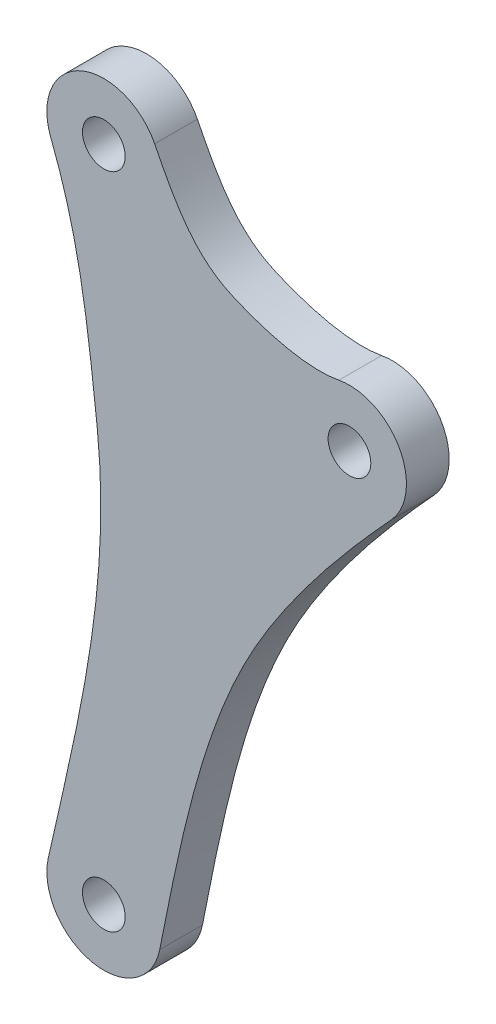
ISO-10303-21;
HEADER;
FILE_DESCRIPTION(('STEP AP214'),'2;1');
FILE_NAME('part.step','',(''),(''),'','','');
FILE_SCHEMA(('AUTOMOTIVE_DESIGN { 1 0 10303 214 1 1 1 1 }'));
ENDSEC;
DATA;
#1=APPLICATION_CONTEXT('core data for automotive mechanical design processes');
#2=APPLICATION_PROTOCOL_DEFINITION('international standard','automotive_design',2000,#1);
#3=PRODUCT_CONTEXT('',#1,'mechanical');
#4=PRODUCT('Part','Part','',(#3));
#5=PRODUCT_RELATED_PRODUCT_CATEGORY('part','',(#4));
#6=PRODUCT_DEFINITION_FORMATION('','',#4);
#7=PRODUCT_DEFINITION_CONTEXT('part definition',#1,'design');
#8=PRODUCT_DEFINITION('design','',#6,#7);
#9=PRODUCT_DEFINITION_SHAPE('','',#8);
#10=(LENGTH_UNIT() NAMED_UNIT(*) SI_UNIT(.MILLI.,.METRE.));
#11=(NAMED_UNIT(*) PLANE_ANGLE_UNIT() SI_UNIT($,.RADIAN.));
#12=(NAMED_UNIT(*) SI_UNIT($,.STERADIAN.) SOLID_ANGLE_UNIT());
#13=UNCERTAINTY_MEASURE_WITH_UNIT(LENGTH_MEASURE(1.E-05),#10,'distance_accuracy_value','');
#14=(GEOMETRIC_REPRESENTATION_CONTEXT(3) GLOBAL_UNCERTAINTY_ASSIGNED_CONTEXT((#13)) GLOBAL_UNIT_ASSIGNED_CONTEXT((#10,
#11,#12)) REPRESENTATION_CONTEXT('',''));
#15=CARTESIAN_POINT('',(0.,0.,0.));
#16=DIRECTION('',(0.,0.,1.));
#17=DIRECTION('',(1.,0.,0.));
#18=AXIS2_PLACEMENT_3D('',#15,#16,#17);
#19=CARTESIAN_POINT('',(90.075671226126,46.9690028449599,3.));
#20=DIRECTION('',(0.,0.,-1.));
#21=DIRECTION('',(-1.,0.,0.));
#22=AXIS2_PLACEMENT_3D('',#19,#20,#21);
#23=PLANE('',#22);
#24=CARTESIAN_POINT('',(98.2930047913281,65.3775283524419,3.));
#25=DIRECTION('',(0.,0.,1.));
#26=DIRECTION('',(1.,0.,0.));
#27=AXIS2_PLACEMENT_3D('',#24,#25,#26);
#28=CIRCLE('',#27,1.5);
#29=CARTESIAN_POINT('',(99.7930047913281,65.3775283524419,3.));
#30=VERTEX_POINT('',#29);
#31=EDGE_CURVE('E157',#30,#30,#28,.T.);
#32=ORIENTED_EDGE('',*,*,#31,.F.);
#33=EDGE_LOOP('',(#32));
#34=FACE_BOUND('',#33,.T.);
#35=CARTESIAN_POINT('',(84.9713185893899,28.397317520344,3.));
#36=CARTESIAN_POINT('',(86.5286245862136,36.2633686429194,3.));
#37=CARTESIAN_POINT('',(88.227335603752,44.7175231555254,3.));
#38=CARTESIAN_POINT('',(94.8996198148878,55.416000824392,3.));
#39=CARTESIAN_POINT('',(98.376312092243,59.555241306599,3.));
#40=CARTESIAN_POINT('',(101.238857322266,62.6716176248005,3.));
#41=B_SPLINE_CURVE_WITH_KNOTS('',3,(#35,#36,#37,#38,#39,#40),.UNSPECIFIED.,.F.,.F.,(4,1,1,4),
(0.,0.588358846523915,0.688358846523915,1.),.UNSPECIFIED.);
#42=CARTESIAN_POINT('',(84.9713185893899,28.397317520344,3.));
#43=VERTEX_POINT('',#42);
#44=CARTESIAN_POINT('',(101.238857322266,62.6716176248005,3.));
#45=VERTEX_POINT('',#44);
#46=EDGE_CURVE('E145',#43,#45,#41,.T.);
#47=ORIENTED_EDGE('',*,*,#46,.T.);
#48=CARTESIAN_POINT('',(98.2930047913281,65.3775283524419,3.));
#49=DIRECTION('',(0.,0.,1.));
#50=DIRECTION('',(1.,0.,0.));
#51=AXIS2_PLACEMENT_3D('',#48,#49,#50);
#52=CIRCLE('',#51,4.00000000000001);
#53=CARTESIAN_POINT('',(97.5465993612567,69.3072712109455,3.));
#54=VERTEX_POINT('',#53);
#55=EDGE_CURVE('E89',#45,#54,#52,.T.);
#56=ORIENTED_EDGE('',*,*,#55,.T.);
#57=CARTESIAN_POINT('',(97.5465993612567,69.3072712109455,3.));
#58=CARTESIAN_POINT('',(95.6927273527089,68.9551514454389,3.));
#59=CARTESIAN_POINT('',(92.7095800962212,69.5389356691718,3.));
#60=CARTESIAN_POINT('',(87.2845297615333,71.8966759610783,3.));
#61=CARTESIAN_POINT('',(85.7655546199661,74.9452628772232,3.));
#62=CARTESIAN_POINT('',(84.6155667565683,77.2148077148412,3.));
#63=B_SPLINE_CURVE_WITH_KNOTS('',3,(#57,#58,#59,#60,#61,#62),.UNSPECIFIED.,.F.,.F.,(4,1,1,4),
(0.,0.443899785183559,0.543899785183559,1.),.UNSPECIFIED.);
#64=CARTESIAN_POINT('',(84.6155667565683,77.2148077148412,3.));
#65=VERTEX_POINT('',#64);
#66=EDGE_CURVE('E102',#54,#65,#63,.T.);
#67=ORIENTED_EDGE('',*,*,#66,.T.);
#68=CARTESIAN_POINT('',(81.0474776232868,75.4068420246361,3.));
#69=DIRECTION('',(0.,0.,1.));
#70=DIRECTION('',(1.,0.,0.));
#71=AXIS2_PLACEMENT_3D('',#68,#69,#70);
#72=CIRCLE('',#71,4.00000000000001);
#73=CARTESIAN_POINT('',(77.3244716495254,73.9442325349442,3.));
#74=VERTEX_POINT('',#73);
#75=EDGE_CURVE('E96',#65,#74,#72,.T.);
#76=ORIENTED_EDGE('',*,*,#75,.T.);
#77=CARTESIAN_POINT('',(77.3244716495254,73.9442325349442,3.));
#78=CARTESIAN_POINT('',(79.1435622509706,69.3138200949018,3.));
#79=CARTESIAN_POINT('',(79.9310185017769,63.6887264714688,3.));
#80=CARTESIAN_POINT('',(81.6632709896459,48.786134392086,3.));
#81=CARTESIAN_POINT('',(79.0803085164264,38.6226873618722,3.));
#82=CARTESIAN_POINT('',(77.145713615016,30.0551956556259,3.));
#83=B_SPLINE_CURVE_WITH_KNOTS('',3,(#77,#78,#79,#80,#81,#82),.UNSPECIFIED.,.F.,.F.,(4,1,1,4),
(0.,0.323426504522803,0.423426504522803,1.),.UNSPECIFIED.);
#84=CARTESIAN_POINT('',(77.145713615016,30.0551956556259,3.));
#85=VERTEX_POINT('',#84);
#86=EDGE_CURVE('E100',#74,#85,#83,.T.);
#87=ORIENTED_EDGE('',*,*,#86,.T.);
#88=CARTESIAN_POINT('',(81.0474776232868,29.1741521698873,3.));
#89=DIRECTION('',(0.,0.,1.));
#90=DIRECTION('',(1.,0.,0.));
#91=AXIS2_PLACEMENT_3D('',#88,#89,#90);
#92=CIRCLE('',#91,4.00000000000001);
#93=EDGE_CURVE('E52',#85,#43,#92,.T.);
#94=ORIENTED_EDGE('',*,*,#93,.T.);
#95=EDGE_LOOP('',(#47,#56,#67,#76,#87,#94));
#96=FACE_BOUND('',#95,.T.);
#97=CARTESIAN_POINT('',(81.0474776232868,75.4068420246361,3.));
#98=DIRECTION('',(0.,0.,1.));
#99=DIRECTION('',(1.,0.,0.));
#100=AXIS2_PLACEMENT_3D('',#97,#98,#99);
#101=CIRCLE('',#100,1.5);
#102=CARTESIAN_POINT('',(82.5474776232868,75.4068420246361,3.));
#103=VERTEX_POINT('',#102);
#104=EDGE_CURVE('E156',#103,#103,#101,.T.);
#105=ORIENTED_EDGE('',*,*,#104,.F.);
#106=EDGE_LOOP('',(#105));
#107=FACE_BOUND('',#106,.T.);
#108=CARTESIAN_POINT('',(81.0474776232868,29.1741521698873,3.));
#109=DIRECTION('',(0.,0.,1.));
#110=DIRECTION('',(1.,0.,0.));
#111=AXIS2_PLACEMENT_3D('',#108,#109,#110);
#112=CIRCLE('',#111,1.5);
#113=CARTESIAN_POINT('',(82.5474776232868,29.1741521698873,3.));
#114=VERTEX_POINT('',#113);
#115=EDGE_CURVE('E164',#114,#114,#112,.T.);
#116=ORIENTED_EDGE('',*,*,#115,.F.);
#117=EDGE_LOOP('',(#116));
#118=FACE_BOUND('',#117,.T.);
#119=ADVANCED_FACE('F34',(#34,#96,#107,#118),#23,.F.);
#120=CARTESIAN_POINT('',(90.075671226126,46.9690028449599,0.));
#121=DIRECTION('',(0.,0.,-1.));
#122=DIRECTION('',(-1.,0.,0.));
#123=AXIS2_PLACEMENT_3D('',#120,#121,#122);
#124=PLANE('',#123);
#125=CARTESIAN_POINT('',(98.2930047913281,65.3775283524419,0.));
#126=DIRECTION('',(0.,0.,1.));
#127=DIRECTION('',(1.,0.,0.));
#128=AXIS2_PLACEMENT_3D('',#125,#126,#127);
#129=CIRCLE('',#128,1.5);
#130=CARTESIAN_POINT('',(99.7930047913281,65.3775283524419,0.));
#131=VERTEX_POINT('',#130);
#132=EDGE_CURVE('E161',#131,#131,#129,.T.);
#133=ORIENTED_EDGE('',*,*,#132,.T.);
#134=EDGE_LOOP('',(#133));
#135=FACE_BOUND('',#134,.T.);
#136=CARTESIAN_POINT('',(84.9713185893899,28.397317520344,0.));
#137=CARTESIAN_POINT('',(86.5286245862136,36.2633686429194,0.));
#138=CARTESIAN_POINT('',(88.227335603752,44.7175231555254,0.));
#139=CARTESIAN_POINT('',(94.8996198148878,55.416000824392,0.));
#140=CARTESIAN_POINT('',(98.376312092243,59.555241306599,0.));
#141=CARTESIAN_POINT('',(101.238857322266,62.6716176248005,0.));
#142=B_SPLINE_CURVE_WITH_KNOTS('',3,(#136,#137,#138,#139,#140,#141),.UNSPECIFIED.,.F.,.F.,(4,1,
1,4),(0.,0.588358846523915,0.688358846523915,1.),.UNSPECIFIED.);
#143=CARTESIAN_POINT('',(84.9713185893899,28.397317520344,0.));
#144=VERTEX_POINT('',#143);
#145=CARTESIAN_POINT('',(101.238857322266,62.6716176248005,0.));
#146=VERTEX_POINT('',#145);
#147=EDGE_CURVE('E160',#144,#146,#142,.T.);
#148=ORIENTED_EDGE('',*,*,#147,.F.);
#149=CARTESIAN_POINT('',(81.0474776232868,29.1741521698873,0.));
#150=DIRECTION('',(0.,0.,1.));
#151=DIRECTION('',(1.,0.,0.));
#152=AXIS2_PLACEMENT_3D('',#149,#150,#151);
#153=CIRCLE('',#152,4.00000000000001);
#154=CARTESIAN_POINT('',(77.145713615016,30.0551956556259,0.));
#155=VERTEX_POINT('',#154);
#156=EDGE_CURVE('E81',#155,#144,#153,.T.);
#157=ORIENTED_EDGE('',*,*,#156,.F.);
#158=CARTESIAN_POINT('',(77.3244716495254,73.9442325349442,0.));
#159=CARTESIAN_POINT('',(79.1435622509706,69.3138200949018,0.));
#160=CARTESIAN_POINT('',(79.9310185017769,63.6887264714688,0.));
#161=CARTESIAN_POINT('',(81.6632709896459,48.786134392086,0.));
#162=CARTESIAN_POINT('',(79.0803085164264,38.6226873618722,0.));
#163=CARTESIAN_POINT('',(77.145713615016,30.0551956556259,0.));
#164=B_SPLINE_CURVE_WITH_KNOTS('',3,(#158,#159,#160,#161,#162,#163),.UNSPECIFIED.,.F.,.F.,(4,1,
1,4),(0.,0.323426504522803,0.423426504522803,1.),.UNSPECIFIED.);
#165=CARTESIAN_POINT('',(77.3244716495254,73.9442325349442,0.));
#166=VERTEX_POINT('',#165);
#167=EDGE_CURVE('E75',#166,#155,#164,.T.);
#168=ORIENTED_EDGE('',*,*,#167,.F.);
#169=CARTESIAN_POINT('',(81.0474776232868,75.4068420246361,0.));
#170=DIRECTION('',(0.,0.,1.));
#171=DIRECTION('',(1.,0.,0.));
#172=AXIS2_PLACEMENT_3D('',#169,#170,#171);
#173=CIRCLE('',#172,4.00000000000001);
#174=CARTESIAN_POINT('',(84.6155667565683,77.2148077148412,0.));
#175=VERTEX_POINT('',#174);
#176=EDGE_CURVE('E110',#175,#166,#173,.T.);
#177=ORIENTED_EDGE('',*,*,#176,.F.);
#178=CARTESIAN_POINT('',(97.5465993612567,69.3072712109455,0.));
#179=CARTESIAN_POINT('',(95.6927273527089,68.9551514454389,0.));
#180=CARTESIAN_POINT('',(92.7095800962212,69.5389356691718,0.));
#181=CARTESIAN_POINT('',(87.2845297615333,71.8966759610783,0.));
#182=CARTESIAN_POINT('',(85.7655546199661,74.9452628772232,0.));
#183=CARTESIAN_POINT('',(84.6155667565683,77.2148077148412,0.));
#184=B_SPLINE_CURVE_WITH_KNOTS('',3,(#178,#179,#180,#181,#182,#183),.UNSPECIFIED.,.F.,.F.,(4,1,
1,4),(0.,0.443899785183559,0.543899785183559,1.),.UNSPECIFIED.);
#185=CARTESIAN_POINT('',(97.5465993612567,69.3072712109455,0.));
#186=VERTEX_POINT('',#185);
#187=EDGE_CURVE('E269',#186,#175,#184,.T.);
#188=ORIENTED_EDGE('',*,*,#187,.F.);
#189=CARTESIAN_POINT('',(98.2930047913281,65.3775283524419,0.));
#190=DIRECTION('',(0.,0.,1.));
#191=DIRECTION('',(1.,0.,0.));
#192=AXIS2_PLACEMENT_3D('',#189,#190,#191);
#193=CIRCLE('',#192,4.00000000000001);
#194=EDGE_CURVE('E268',#146,#186,#193,.T.);
#195=ORIENTED_EDGE('',*,*,#194,.F.);
#196=EDGE_LOOP('',(#148,#157,#168,#177,#188,#195));
#197=FACE_BOUND('',#196,.T.);
#198=CARTESIAN_POINT('',(81.0474776232868,75.4068420246361,0.));
#199=DIRECTION('',(0.,0.,1.));
#200=DIRECTION('',(1.,0.,0.));
#201=AXIS2_PLACEMENT_3D('',#198,#199,#200);
#202=CIRCLE('',#201,1.5);
#203=CARTESIAN_POINT('',(82.5474776232868,75.4068420246361,0.));
#204=VERTEX_POINT('',#203);
#205=EDGE_CURVE('E150',#204,#204,#202,.T.);
#206=ORIENTED_EDGE('',*,*,#205,.T.);
#207=EDGE_LOOP('',(#206));
#208=FACE_BOUND('',#207,.T.);
#209=CARTESIAN_POINT('',(81.0474776232868,29.1741521698873,0.));
#210=DIRECTION('',(0.,0.,1.));
#211=DIRECTION('',(1.,0.,0.));
#212=AXIS2_PLACEMENT_3D('',#209,#210,#211);
#213=CIRCLE('',#212,1.5);
#214=CARTESIAN_POINT('',(82.5474776232868,29.1741521698873,0.));
#215=VERTEX_POINT('',#214);
#216=EDGE_CURVE('E167',#215,#215,#213,.T.);
#217=ORIENTED_EDGE('',*,*,#216,.T.);
#218=EDGE_LOOP('',(#217));
#219=FACE_BOUND('',#218,.T.);
#220=ADVANCED_FACE('F177',(#135,#197,#208,#219),#124,.T.);
#221=DIRECTION('',(0.,0.,-1.));
#222=VECTOR('',#221,1.);
#223=SURFACE_OF_LINEAR_EXTRUSION('',#41,#222);
#224=ORIENTED_EDGE('',*,*,#147,.T.);
#225=DIRECTION('',(0.,0.,-1.));
#226=VECTOR('',#225,1.);
#227=CARTESIAN_POINT('',(101.238857322266,62.6716176248005,3.));
#228=LINE('',#227,#226);
#229=EDGE_CURVE('E11',#45,#146,#228,.T.);
#230=ORIENTED_EDGE('',*,*,#229,.F.);
#231=ORIENTED_EDGE('',*,*,#46,.F.);
#232=DIRECTION('',(0.,0.,-1.));
#233=VECTOR('',#232,1.);
#234=CARTESIAN_POINT('',(84.9713185893899,28.397317520344,3.));
#235=LINE('',#234,#233);
#236=EDGE_CURVE('E116',#43,#144,#235,.T.);
#237=ORIENTED_EDGE('',*,*,#236,.T.);
#238=EDGE_LOOP('',(#224,#230,#231,#237));
#239=FACE_BOUND('',#238,.T.);
#240=ADVANCED_FACE('F36',(#239),#223,.F.);
#241=CARTESIAN_POINT('',(98.2930047913281,65.3775283524419,3.));
#242=DIRECTION('',(0.,0.,-1.));
#243=DIRECTION('',(-1.,0.,0.));
#244=AXIS2_PLACEMENT_3D('',#241,#242,#243);
#245=CYLINDRICAL_SURFACE('',#244,4.00000000000001);
#246=ORIENTED_EDGE('',*,*,#194,.T.);
#247=DIRECTION('',(0.,0.,-1.));
#248=VECTOR('',#247,1.);
#249=CARTESIAN_POINT('',(97.5465993612567,69.3072712109455,3.));
#250=LINE('',#249,#248);
#251=EDGE_CURVE('E44',#54,#186,#250,.T.);
#252=ORIENTED_EDGE('',*,*,#251,.F.);
#253=ORIENTED_EDGE('',*,*,#55,.F.);
#254=ORIENTED_EDGE('',*,*,#229,.T.);
#255=EDGE_LOOP('',(#246,#252,#253,#254));
#256=FACE_BOUND('',#255,.T.);
#257=ADVANCED_FACE('F136',(#256),#245,.T.);
#258=DIRECTION('',(0.,0.,-1.));
#259=VECTOR('',#258,1.);
#260=SURFACE_OF_LINEAR_EXTRUSION('',#63,#259);
#261=ORIENTED_EDGE('',*,*,#187,.T.);
#262=DIRECTION('',(0.,0.,-1.));
#263=VECTOR('',#262,1.);
#264=CARTESIAN_POINT('',(84.6155667565683,77.2148077148412,3.));
#265=LINE('',#264,#263);
#266=EDGE_CURVE('E111',#65,#175,#265,.T.);
#267=ORIENTED_EDGE('',*,*,#266,.F.);
#268=ORIENTED_EDGE('',*,*,#66,.F.);
#269=ORIENTED_EDGE('',*,*,#251,.T.);
#270=EDGE_LOOP('',(#261,#267,#268,#269));
#271=FACE_BOUND('',#270,.T.);
#272=ADVANCED_FACE('F134',(#271),#260,.F.);
#273=CARTESIAN_POINT('',(81.0474776232868,75.4068420246361,3.));
#274=DIRECTION('',(0.,0.,-1.));
#275=DIRECTION('',(-1.,0.,0.));
#276=AXIS2_PLACEMENT_3D('',#273,#274,#275);
#277=CYLINDRICAL_SURFACE('',#276,4.00000000000001);
#278=ORIENTED_EDGE('',*,*,#176,.T.);
#279=DIRECTION('',(0.,0.,-1.));
#280=VECTOR('',#279,1.);
#281=CARTESIAN_POINT('',(77.3244716495254,73.9442325349442,3.));
#282=LINE('',#281,#280);
#283=EDGE_CURVE('E107',#74,#166,#282,.T.);
#284=ORIENTED_EDGE('',*,*,#283,.F.);
#285=ORIENTED_EDGE('',*,*,#75,.F.);
#286=ORIENTED_EDGE('',*,*,#266,.T.);
#287=EDGE_LOOP('',(#278,#284,#285,#286));
#288=FACE_BOUND('',#287,.T.);
#289=ADVANCED_FACE('F108',(#288),#277,.T.);
#290=DIRECTION('',(0.,0.,-1.));
#291=VECTOR('',#290,1.);
#292=SURFACE_OF_LINEAR_EXTRUSION('',#83,#291);
#293=ORIENTED_EDGE('',*,*,#167,.T.);
#294=DIRECTION('',(0.,0.,-1.));
#295=VECTOR('',#294,1.);
#296=CARTESIAN_POINT('',(77.145713615016,30.0551956556259,3.));
#297=LINE('',#296,#295);
#298=EDGE_CURVE('E112',#85,#155,#297,.T.);
#299=ORIENTED_EDGE('',*,*,#298,.F.);
#300=ORIENTED_EDGE('',*,*,#86,.F.);
#301=ORIENTED_EDGE('',*,*,#283,.T.);
#302=EDGE_LOOP('',(#293,#299,#300,#301));
#303=FACE_BOUND('',#302,.T.);
#304=ADVANCED_FACE('F114',(#303),#292,.F.);
#305=CARTESIAN_POINT('',(81.0474776232868,29.1741521698873,3.));
#306=DIRECTION('',(0.,0.,-1.));
#307=DIRECTION('',(-1.,0.,0.));
#308=AXIS2_PLACEMENT_3D('',#305,#306,#307);
#309=CYLINDRICAL_SURFACE('',#308,4.00000000000001);
#310=ORIENTED_EDGE('',*,*,#156,.T.);
#311=ORIENTED_EDGE('',*,*,#236,.F.);
#312=ORIENTED_EDGE('',*,*,#93,.F.);
#313=ORIENTED_EDGE('',*,*,#298,.T.);
#314=EDGE_LOOP('',(#310,#311,#312,#313));
#315=FACE_BOUND('',#314,.T.);
#316=ADVANCED_FACE('F130',(#315),#309,.T.);
#317=CARTESIAN_POINT('',(81.0474776232868,75.4068420246361,3.));
#318=DIRECTION('',(0.,0.,-1.));
#319=DIRECTION('',(-1.,0.,0.));
#320=AXIS2_PLACEMENT_3D('',#317,#318,#319);
#321=CYLINDRICAL_SURFACE('',#320,1.5);
#322=ORIENTED_EDGE('',*,*,#104,.T.);
#323=EDGE_LOOP('',(#322));
#324=FACE_BOUND('',#323,.T.);
#325=ORIENTED_EDGE('',*,*,#205,.F.);
#326=EDGE_LOOP('',(#325));
#327=FACE_BOUND('',#326,.T.);
#328=ADVANCED_FACE('F186',(#324,#327),#321,.F.);
#329=CARTESIAN_POINT('',(98.2930047913281,65.3775283524419,3.));
#330=DIRECTION('',(0.,0.,-1.));
#331=DIRECTION('',(-1.,0.,0.));
#332=AXIS2_PLACEMENT_3D('',#329,#330,#331);
#333=CYLINDRICAL_SURFACE('',#332,1.5);
#334=ORIENTED_EDGE('',*,*,#31,.T.);
#335=EDGE_LOOP('',(#334));
#336=FACE_BOUND('',#335,.T.);
#337=ORIENTED_EDGE('',*,*,#132,.F.);
#338=EDGE_LOOP('',(#337));
#339=FACE_BOUND('',#338,.T.);
#340=ADVANCED_FACE('F189',(#336,#339),#333,.F.);
#341=CARTESIAN_POINT('',(81.0474776232868,29.1741521698873,3.));
#342=DIRECTION('',(0.,0.,-1.));
#343=DIRECTION('',(-1.,0.,0.));
#344=AXIS2_PLACEMENT_3D('',#341,#342,#343);
#345=CYLINDRICAL_SURFACE('',#344,1.5);
#346=ORIENTED_EDGE('',*,*,#115,.T.);
#347=EDGE_LOOP('',(#346));
#348=FACE_BOUND('',#347,.T.);
#349=ORIENTED_EDGE('',*,*,#216,.F.);
#350=EDGE_LOOP('',(#349));
#351=FACE_BOUND('',#350,.T.);
#352=ADVANCED_FACE('F173',(#348,#351),#345,.F.);
#353=CLOSED_SHELL('',(#119,#220,#240,#257,#272,#289,#304,#316,#328,#340,#352));
#354=MANIFOLD_SOLID_BREP('B2',#353);
#355=ADVANCED_BREP_SHAPE_REPRESENTATION('',(#18,#354),#14);
#356=SHAPE_DEFINITION_REPRESENTATION(#9,#355);
ENDSEC;
END-ISO-10303-21;
